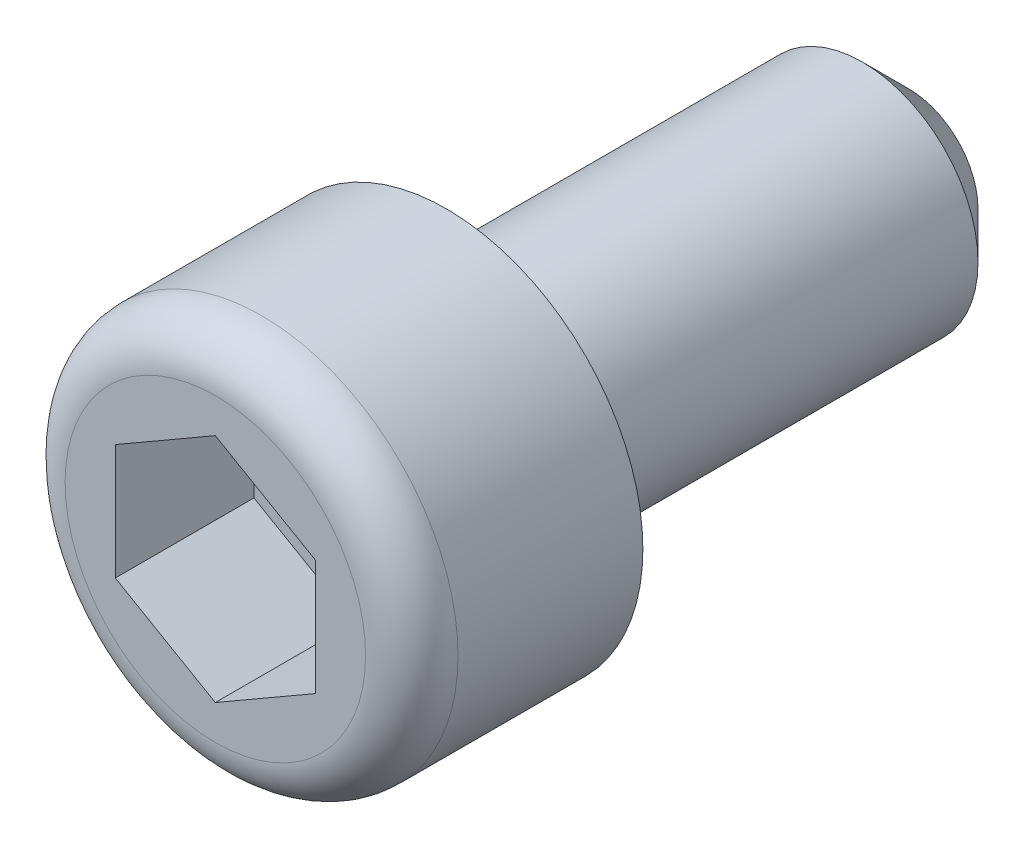
ISO-10303-21;
HEADER;
FILE_DESCRIPTION(('STEP AP214'),'2;1');
FILE_NAME('part.step','',(''),(''),'','','');
FILE_SCHEMA(('AUTOMOTIVE_DESIGN { 1 0 10303 214 1 1 1 1 }'));
ENDSEC;
DATA;
#1=APPLICATION_CONTEXT('core data for automotive mechanical design processes');
#2=APPLICATION_PROTOCOL_DEFINITION('international standard','automotive_design',2000,#1);
#3=PRODUCT_CONTEXT('',#1,'mechanical');
#4=PRODUCT('Part','Part','',(#3));
#5=PRODUCT_RELATED_PRODUCT_CATEGORY('part','',(#4));
#6=PRODUCT_DEFINITION_FORMATION('','',#4);
#7=PRODUCT_DEFINITION_CONTEXT('part definition',#1,'design');
#8=PRODUCT_DEFINITION('design','',#6,#7);
#9=PRODUCT_DEFINITION_SHAPE('','',#8);
#10=(LENGTH_UNIT() NAMED_UNIT(*) SI_UNIT(.MILLI.,.METRE.));
#11=(NAMED_UNIT(*) PLANE_ANGLE_UNIT() SI_UNIT($,.RADIAN.));
#12=(NAMED_UNIT(*) SI_UNIT($,.STERADIAN.) SOLID_ANGLE_UNIT());
#13=UNCERTAINTY_MEASURE_WITH_UNIT(LENGTH_MEASURE(1.E-05),#10,'distance_accuracy_value','');
#14=(GEOMETRIC_REPRESENTATION_CONTEXT(3) GLOBAL_UNCERTAINTY_ASSIGNED_CONTEXT((#13)) GLOBAL_UNIT_ASSIGNED_CONTEXT((#10,
#11,#12)) REPRESENTATION_CONTEXT('',''));
#15=CARTESIAN_POINT('',(0.,0.,0.));
#16=DIRECTION('',(0.,0.,1.));
#17=DIRECTION('',(1.,0.,0.));
#18=AXIS2_PLACEMENT_3D('',#15,#16,#17);
#19=CARTESIAN_POINT('',(0.,0.,0.));
#20=DIRECTION('',(0.,0.,-1.));
#21=DIRECTION('',(-1.,0.,0.));
#22=AXIS2_PLACEMENT_3D('',#19,#20,#21);
#23=PLANE('',#22);
#24=CARTESIAN_POINT('',(0.,0.,0.));
#25=DIRECTION('',(0.,0.,-1.));
#26=DIRECTION('',(-1.,0.,0.));
#27=AXIS2_PLACEMENT_3D('',#24,#25,#26);
#28=CIRCLE('',#27,3.25);
#29=CARTESIAN_POINT('',(-3.25,0.,0.));
#30=VERTEX_POINT('',#29);
#31=EDGE_CURVE('E41',#30,#30,#28,.F.);
#32=ORIENTED_EDGE('',*,*,#31,.T.);
#33=EDGE_LOOP('',(#32));
#34=FACE_BOUND('',#33,.T.);
#35=DIRECTION('',(-0.866025403784439,-0.5,0.));
#36=VECTOR('',#35,1.);
#37=CARTESIAN_POINT('',(0.,2.5,0.));
#38=LINE('',#37,#36);
#39=CARTESIAN_POINT('',(0.,2.5,0.));
#40=VERTEX_POINT('',#39);
#41=CARTESIAN_POINT('',(-2.1650635094611,1.25,0.));
#42=VERTEX_POINT('',#41);
#43=EDGE_CURVE('E122',#40,#42,#38,.T.);
#44=ORIENTED_EDGE('',*,*,#43,.F.);
#45=DIRECTION('',(-0.866025403784439,0.5,0.));
#46=VECTOR('',#45,1.);
#47=CARTESIAN_POINT('',(2.1650635094611,1.25,0.));
#48=LINE('',#47,#46);
#49=CARTESIAN_POINT('',(2.1650635094611,1.25,0.));
#50=VERTEX_POINT('',#49);
#51=EDGE_CURVE('E48',#50,#40,#48,.T.);
#52=ORIENTED_EDGE('',*,*,#51,.F.);
#53=DIRECTION('',(0.,1.,0.));
#54=VECTOR('',#53,1.);
#55=CARTESIAN_POINT('',(2.1650635094611,-1.25,0.));
#56=LINE('',#55,#54);
#57=CARTESIAN_POINT('',(2.1650635094611,-1.25,0.));
#58=VERTEX_POINT('',#57);
#59=EDGE_CURVE('E131',#58,#50,#56,.T.);
#60=ORIENTED_EDGE('',*,*,#59,.F.);
#61=DIRECTION('',(0.866025403784439,0.5,0.));
#62=VECTOR('',#61,1.);
#63=CARTESIAN_POINT('',(0.,-2.5,0.));
#64=LINE('',#63,#62);
#65=CARTESIAN_POINT('',(0.,-2.5,0.));
#66=VERTEX_POINT('',#65);
#67=EDGE_CURVE('E129',#66,#58,#64,.T.);
#68=ORIENTED_EDGE('',*,*,#67,.F.);
#69=DIRECTION('',(0.866025403784439,-0.5,0.));
#70=VECTOR('',#69,1.);
#71=CARTESIAN_POINT('',(-2.1650635094611,-1.25,0.));
#72=LINE('',#71,#70);
#73=CARTESIAN_POINT('',(-2.1650635094611,-1.25,0.));
#74=VERTEX_POINT('',#73);
#75=EDGE_CURVE('E96',#74,#66,#72,.T.);
#76=ORIENTED_EDGE('',*,*,#75,.F.);
#77=DIRECTION('',(0.,-1.,0.));
#78=VECTOR('',#77,1.);
#79=CARTESIAN_POINT('',(-2.1650635094611,1.25,0.));
#80=LINE('',#79,#78);
#81=EDGE_CURVE('E125',#42,#74,#80,.T.);
#82=ORIENTED_EDGE('',*,*,#81,.F.);
#83=EDGE_LOOP('',(#44,#52,#60,#68,#76,#82));
#84=FACE_BOUND('',#83,.T.);
#85=ADVANCED_FACE('F33',(#34,#84),#23,.F.);
#86=CARTESIAN_POINT('',(0.,0.,156.291575098795));
#87=DIRECTION('',(0.,0.,1.));
#88=DIRECTION('',(1.,0.,0.));
#89=AXIS2_PLACEMENT_3D('',#86,#87,#88);
#90=CYLINDRICAL_SURFACE('',#89,4.25);
#91=CARTESIAN_POINT('',(0.,0.,-1.));
#92=DIRECTION('',(0.,0.,-1.));
#93=DIRECTION('',(-1.,0.,0.));
#94=AXIS2_PLACEMENT_3D('',#91,#92,#93);
#95=CIRCLE('',#94,4.25);
#96=CARTESIAN_POINT('',(-4.25,0.,-1.));
#97=VERTEX_POINT('',#96);
#98=EDGE_CURVE('E11',#97,#97,#95,.T.);
#99=ORIENTED_EDGE('',*,*,#98,.T.);
#100=EDGE_LOOP('',(#99));
#101=FACE_BOUND('',#100,.T.);
#102=CARTESIAN_POINT('',(0.,0.,-5.));
#103=DIRECTION('',(0.,0.,1.));
#104=DIRECTION('',(1.,0.,0.));
#105=AXIS2_PLACEMENT_3D('',#102,#103,#104);
#106=CIRCLE('',#105,4.25);
#107=CARTESIAN_POINT('',(4.25,0.,-5.));
#108=VERTEX_POINT('',#107);
#109=EDGE_CURVE('E143',#108,#108,#106,.T.);
#110=ORIENTED_EDGE('',*,*,#109,.T.);
#111=EDGE_LOOP('',(#110));
#112=FACE_BOUND('',#111,.T.);
#113=ADVANCED_FACE('F165',(#101,#112),#90,.T.);
#114=CARTESIAN_POINT('',(0.,4.25,-5.));
#115=DIRECTION('',(0.,0.,1.));
#116=DIRECTION('',(1.,0.,0.));
#117=AXIS2_PLACEMENT_3D('',#114,#115,#116);
#118=PLANE('',#117);
#119=ORIENTED_EDGE('',*,*,#109,.F.);
#120=EDGE_LOOP('',(#119));
#121=FACE_BOUND('',#120,.T.);
#122=CARTESIAN_POINT('',(0.,0.,-5.));
#123=DIRECTION('',(0.,0.,1.));
#124=DIRECTION('',(1.,0.,0.));
#125=AXIS2_PLACEMENT_3D('',#122,#123,#124);
#126=CIRCLE('',#125,2.5);
#127=CARTESIAN_POINT('',(2.5,0.,-5.));
#128=VERTEX_POINT('',#127);
#129=EDGE_CURVE('E135',#128,#128,#126,.T.);
#130=ORIENTED_EDGE('',*,*,#129,.T.);
#131=EDGE_LOOP('',(#130));
#132=FACE_BOUND('',#131,.T.);
#133=ADVANCED_FACE('F170',(#121,#132),#118,.F.);
#134=CARTESIAN_POINT('',(0.,0.,156.291575098795));
#135=DIRECTION('',(0.,0.,1.));
#136=DIRECTION('',(1.,0.,0.));
#137=AXIS2_PLACEMENT_3D('',#134,#135,#136);
#138=CYLINDRICAL_SURFACE('',#137,2.5);
#139=CARTESIAN_POINT('',(0.,0.,-14.));
#140=DIRECTION('',(0.,0.,1.));
#141=DIRECTION('',(1.,0.,0.));
#142=AXIS2_PLACEMENT_3D('',#139,#140,#141);
#143=CIRCLE('',#142,2.5);
#144=CARTESIAN_POINT('',(2.5,0.,-14.));
#145=VERTEX_POINT('',#144);
#146=EDGE_CURVE('E146',#145,#145,#143,.T.);
#147=ORIENTED_EDGE('',*,*,#146,.T.);
#148=EDGE_LOOP('',(#147));
#149=FACE_BOUND('',#148,.T.);
#150=ORIENTED_EDGE('',*,*,#129,.F.);
#151=EDGE_LOOP('',(#150));
#152=FACE_BOUND('',#151,.T.);
#153=ADVANCED_FACE('F176',(#149,#152),#138,.T.);
#154=CARTESIAN_POINT('',(0.,2.5,-15.));
#155=DIRECTION('',(0.,0.,1.));
#156=DIRECTION('',(1.,0.,0.));
#157=AXIS2_PLACEMENT_3D('',#154,#155,#156);
#158=PLANE('',#157);
#159=CARTESIAN_POINT('',(0.,0.,-15.));
#160=DIRECTION('',(0.,0.,1.));
#161=DIRECTION('',(1.,0.,0.));
#162=AXIS2_PLACEMENT_3D('',#159,#160,#161);
#163=CIRCLE('',#162,1.49999999999997);
#164=CARTESIAN_POINT('',(1.49999999999997,0.,-15.));
#165=VERTEX_POINT('',#164);
#166=EDGE_CURVE('E149',#165,#165,#163,.F.);
#167=ORIENTED_EDGE('',*,*,#166,.T.);
#168=EDGE_LOOP('',(#167));
#169=FACE_BOUND('',#168,.T.);
#170=ADVANCED_FACE('F180',(#169),#158,.F.);
#171=CARTESIAN_POINT('',(2.1650635094611,1.25,-3.));
#172=DIRECTION('',(0.5,0.866025403784438,0.));
#173=DIRECTION('',(-0.866025403784439,0.5,0.));
#174=AXIS2_PLACEMENT_3D('',#171,#172,#173);
#175=PLANE('',#174);
#176=ORIENTED_EDGE('',*,*,#51,.T.);
#177=DIRECTION('',(0.,0.,1.));
#178=VECTOR('',#177,1.);
#179=CARTESIAN_POINT('',(0.,2.5,-3.));
#180=LINE('',#179,#178);
#181=CARTESIAN_POINT('',(0.,2.5,-3.));
#182=VERTEX_POINT('',#181);
#183=EDGE_CURVE('E78',#182,#40,#180,.T.);
#184=ORIENTED_EDGE('',*,*,#183,.F.);
#185=DIRECTION('',(-0.866025403784439,0.5,0.));
#186=VECTOR('',#185,1.);
#187=CARTESIAN_POINT('',(2.1650635094611,1.25,-3.));
#188=LINE('',#187,#186);
#189=CARTESIAN_POINT('',(2.1650635094611,1.25,-3.));
#190=VERTEX_POINT('',#189);
#191=EDGE_CURVE('E133',#190,#182,#188,.T.);
#192=ORIENTED_EDGE('',*,*,#191,.F.);
#193=DIRECTION('',(0.,0.,1.));
#194=VECTOR('',#193,1.);
#195=CARTESIAN_POINT('',(2.1650635094611,1.25,-3.));
#196=LINE('',#195,#194);
#197=EDGE_CURVE('E56',#190,#50,#196,.T.);
#198=ORIENTED_EDGE('',*,*,#197,.T.);
#199=EDGE_LOOP('',(#176,#184,#192,#198));
#200=FACE_BOUND('',#199,.T.);
#201=ADVANCED_FACE('F184',(#200),#175,.F.);
#202=CARTESIAN_POINT('',(2.1650635094611,-1.25,-3.));
#203=DIRECTION('',(1.,0.,0.));
#204=DIRECTION('',(0.,0.,-1.));
#205=AXIS2_PLACEMENT_3D('',#202,#203,#204);
#206=PLANE('',#205);
#207=ORIENTED_EDGE('',*,*,#59,.T.);
#208=ORIENTED_EDGE('',*,*,#197,.F.);
#209=DIRECTION('',(0.,1.,0.));
#210=VECTOR('',#209,1.);
#211=CARTESIAN_POINT('',(2.1650635094611,-1.25,-3.));
#212=LINE('',#211,#210);
#213=CARTESIAN_POINT('',(2.1650635094611,-1.25,-3.));
#214=VERTEX_POINT('',#213);
#215=EDGE_CURVE('E108',#214,#190,#212,.T.);
#216=ORIENTED_EDGE('',*,*,#215,.F.);
#217=DIRECTION('',(0.,0.,1.));
#218=VECTOR('',#217,1.);
#219=CARTESIAN_POINT('',(2.1650635094611,-1.25,-3.));
#220=LINE('',#219,#218);
#221=EDGE_CURVE('E100',#214,#58,#220,.T.);
#222=ORIENTED_EDGE('',*,*,#221,.T.);
#223=EDGE_LOOP('',(#207,#208,#216,#222));
#224=FACE_BOUND('',#223,.T.);
#225=ADVANCED_FACE('F188',(#224),#206,.F.);
#226=CARTESIAN_POINT('',(0.,-2.5,-3.));
#227=DIRECTION('',(0.5,-0.866025403784439,0.));
#228=DIRECTION('',(0.866025403784439,0.5,0.));
#229=AXIS2_PLACEMENT_3D('',#226,#227,#228);
#230=PLANE('',#229);
#231=ORIENTED_EDGE('',*,*,#67,.T.);
#232=ORIENTED_EDGE('',*,*,#221,.F.);
#233=DIRECTION('',(0.866025403784439,0.5,0.));
#234=VECTOR('',#233,1.);
#235=CARTESIAN_POINT('',(0.,-2.5,-3.));
#236=LINE('',#235,#234);
#237=CARTESIAN_POINT('',(0.,-2.5,-3.));
#238=VERTEX_POINT('',#237);
#239=EDGE_CURVE('E104',#238,#214,#236,.T.);
#240=ORIENTED_EDGE('',*,*,#239,.F.);
#241=DIRECTION('',(0.,0.,1.));
#242=VECTOR('',#241,1.);
#243=CARTESIAN_POINT('',(0.,-2.5,-3.));
#244=LINE('',#243,#242);
#245=EDGE_CURVE('E89',#238,#66,#244,.T.);
#246=ORIENTED_EDGE('',*,*,#245,.T.);
#247=EDGE_LOOP('',(#231,#232,#240,#246));
#248=FACE_BOUND('',#247,.T.);
#249=ADVANCED_FACE('F105',(#248),#230,.F.);
#250=CARTESIAN_POINT('',(-2.1650635094611,-1.25,-3.));
#251=DIRECTION('',(-0.5,-0.866025403784438,0.));
#252=DIRECTION('',(0.866025403784439,-0.5,0.));
#253=AXIS2_PLACEMENT_3D('',#250,#251,#252);
#254=PLANE('',#253);
#255=ORIENTED_EDGE('',*,*,#75,.T.);
#256=ORIENTED_EDGE('',*,*,#245,.F.);
#257=DIRECTION('',(0.866025403784439,-0.5,0.));
#258=VECTOR('',#257,1.);
#259=CARTESIAN_POINT('',(-2.1650635094611,-1.25,-3.));
#260=LINE('',#259,#258);
#261=CARTESIAN_POINT('',(-2.1650635094611,-1.25,-3.));
#262=VERTEX_POINT('',#261);
#263=EDGE_CURVE('E93',#262,#238,#260,.T.);
#264=ORIENTED_EDGE('',*,*,#263,.F.);
#265=DIRECTION('',(0.,0.,1.));
#266=VECTOR('',#265,1.);
#267=CARTESIAN_POINT('',(-2.1650635094611,-1.25,-3.));
#268=LINE('',#267,#266);
#269=EDGE_CURVE('E101',#262,#74,#268,.T.);
#270=ORIENTED_EDGE('',*,*,#269,.T.);
#271=EDGE_LOOP('',(#255,#256,#264,#270));
#272=FACE_BOUND('',#271,.T.);
#273=ADVANCED_FACE('F91',(#272),#254,.F.);
#274=CARTESIAN_POINT('',(-2.1650635094611,1.25,-3.));
#275=DIRECTION('',(-1.,0.,0.));
#276=DIRECTION('',(0.,-1.,0.));
#277=AXIS2_PLACEMENT_3D('',#274,#275,#276);
#278=PLANE('',#277);
#279=ORIENTED_EDGE('',*,*,#81,.T.);
#280=ORIENTED_EDGE('',*,*,#269,.F.);
#281=DIRECTION('',(0.,-1.,0.));
#282=VECTOR('',#281,1.);
#283=CARTESIAN_POINT('',(-2.1650635094611,1.25,-3.));
#284=LINE('',#283,#282);
#285=CARTESIAN_POINT('',(-2.1650635094611,1.25,-3.));
#286=VERTEX_POINT('',#285);
#287=EDGE_CURVE('E114',#286,#262,#284,.T.);
#288=ORIENTED_EDGE('',*,*,#287,.F.);
#289=DIRECTION('',(0.,0.,1.));
#290=VECTOR('',#289,1.);
#291=CARTESIAN_POINT('',(-2.1650635094611,1.25,-3.));
#292=LINE('',#291,#290);
#293=EDGE_CURVE('E138',#286,#42,#292,.T.);
#294=ORIENTED_EDGE('',*,*,#293,.T.);
#295=EDGE_LOOP('',(#279,#280,#288,#294));
#296=FACE_BOUND('',#295,.T.);
#297=ADVANCED_FACE('F192',(#296),#278,.F.);
#298=CARTESIAN_POINT('',(0.,2.5,-3.));
#299=DIRECTION('',(-0.5,0.866025403784439,0.));
#300=DIRECTION('',(-0.866025403784439,-0.5,0.));
#301=AXIS2_PLACEMENT_3D('',#298,#299,#300);
#302=PLANE('',#301);
#303=ORIENTED_EDGE('',*,*,#43,.T.);
#304=ORIENTED_EDGE('',*,*,#293,.F.);
#305=DIRECTION('',(-0.866025403784439,-0.5,0.));
#306=VECTOR('',#305,1.);
#307=CARTESIAN_POINT('',(0.,2.5,-3.));
#308=LINE('',#307,#306);
#309=EDGE_CURVE('E116',#182,#286,#308,.T.);
#310=ORIENTED_EDGE('',*,*,#309,.F.);
#311=ORIENTED_EDGE('',*,*,#183,.T.);
#312=EDGE_LOOP('',(#303,#304,#310,#311));
#313=FACE_BOUND('',#312,.T.);
#314=ADVANCED_FACE('F189',(#313),#302,.F.);
#315=CARTESIAN_POINT('',(0.,0.,-3.));
#316=DIRECTION('',(0.,0.,1.));
#317=DIRECTION('',(1.,0.,0.));
#318=AXIS2_PLACEMENT_3D('',#315,#316,#317);
#319=PLANE('',#318);
#320=ORIENTED_EDGE('',*,*,#191,.T.);
#321=ORIENTED_EDGE('',*,*,#309,.T.);
#322=ORIENTED_EDGE('',*,*,#287,.T.);
#323=ORIENTED_EDGE('',*,*,#263,.T.);
#324=ORIENTED_EDGE('',*,*,#239,.T.);
#325=ORIENTED_EDGE('',*,*,#215,.T.);
#326=EDGE_LOOP('',(#320,#321,#322,#323,#324,#325));
#327=FACE_BOUND('',#326,.T.);
#328=ADVANCED_FACE('F111',(#327),#319,.T.);
#329=CARTESIAN_POINT('',(0.,0.,-14.));
#330=DIRECTION('',(0.,0.,1.));
#331=DIRECTION('',(1.,0.,0.));
#332=AXIS2_PLACEMENT_3D('',#329,#330,#331);
#333=CONICAL_SURFACE('',#332,2.5,0.785398163397454);
#334=ORIENTED_EDGE('',*,*,#166,.F.);
#335=EDGE_LOOP('',(#334));
#336=FACE_BOUND('',#335,.T.);
#337=ORIENTED_EDGE('',*,*,#146,.F.);
#338=EDGE_LOOP('',(#337));
#339=FACE_BOUND('',#338,.T.);
#340=ADVANCED_FACE('F157',(#336,#339),#333,.T.);
#341=CARTESIAN_POINT('',(0.,0.,-1.));
#342=DIRECTION('',(0.,0.,-1.));
#343=DIRECTION('',(-1.,0.,0.));
#344=AXIS2_PLACEMENT_3D('',#341,#342,#343);
#345=TOROIDAL_SURFACE('',#344,3.25,1.);
#346=ORIENTED_EDGE('',*,*,#98,.F.);
#347=EDGE_LOOP('',(#346));
#348=FACE_BOUND('',#347,.T.);
#349=ORIENTED_EDGE('',*,*,#31,.F.);
#350=EDGE_LOOP('',(#349));
#351=FACE_BOUND('',#350,.T.);
#352=ADVANCED_FACE('F35',(#348,#351),#345,.T.);
#353=CLOSED_SHELL('',(#85,#113,#133,#153,#170,#201,#225,#249,#273,#297,#314,#328,#340,#352));
#354=MANIFOLD_SOLID_BREP('B2',#353);
#355=ADVANCED_BREP_SHAPE_REPRESENTATION('',(#18,#354),#14);
#356=SHAPE_DEFINITION_REPRESENTATION(#9,#355);
ENDSEC;
END-ISO-10303-21;
